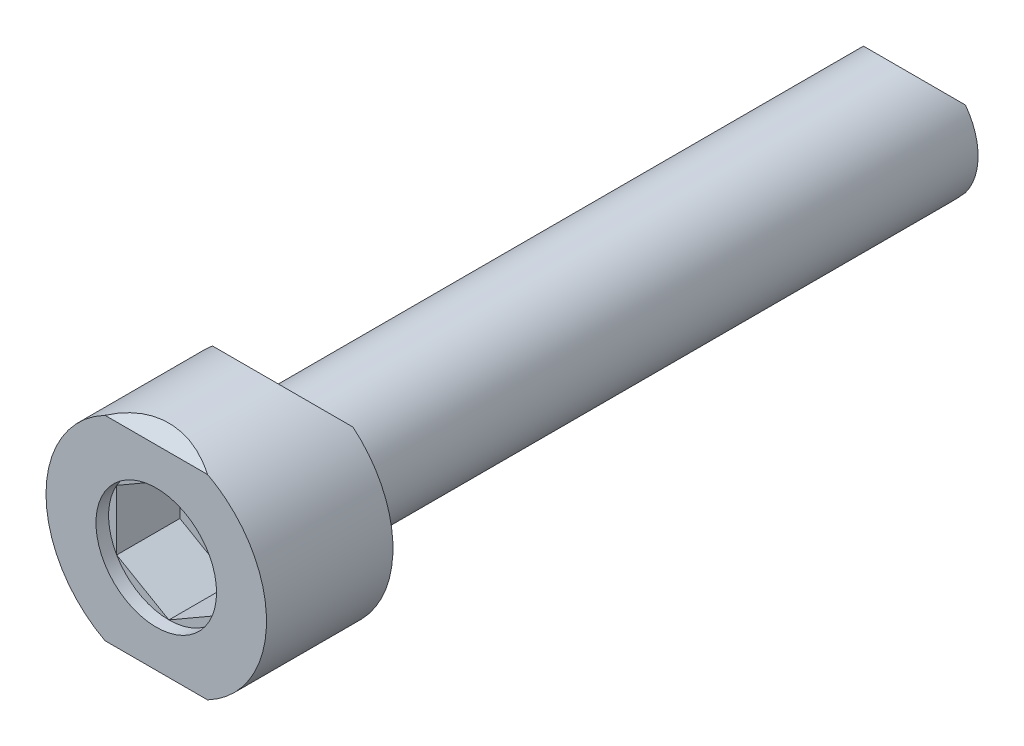
ISO-10303-21;
HEADER;
FILE_DESCRIPTION(('STEP AP214'),'2;1');
FILE_NAME('part.step','',(''),(''),'','','');
FILE_SCHEMA(('AUTOMOTIVE_DESIGN { 1 0 10303 214 1 1 1 1 }'));
ENDSEC;
DATA;
#1=APPLICATION_CONTEXT('core data for automotive mechanical design processes');
#2=APPLICATION_PROTOCOL_DEFINITION('international standard','automotive_design',2000,#1);
#3=PRODUCT_CONTEXT('',#1,'mechanical');
#4=PRODUCT('Part','Part','',(#3));
#5=PRODUCT_RELATED_PRODUCT_CATEGORY('part','',(#4));
#6=PRODUCT_DEFINITION_FORMATION('','',#4);
#7=PRODUCT_DEFINITION_CONTEXT('part definition',#1,'design');
#8=PRODUCT_DEFINITION('design','',#6,#7);
#9=PRODUCT_DEFINITION_SHAPE('','',#8);
#10=(LENGTH_UNIT() NAMED_UNIT(*) SI_UNIT(.MILLI.,.METRE.));
#11=(NAMED_UNIT(*) PLANE_ANGLE_UNIT() SI_UNIT($,.RADIAN.));
#12=(NAMED_UNIT(*) SI_UNIT($,.STERADIAN.) SOLID_ANGLE_UNIT());
#13=UNCERTAINTY_MEASURE_WITH_UNIT(LENGTH_MEASURE(1.E-05),#10,'distance_accuracy_value','');
#14=(GEOMETRIC_REPRESENTATION_CONTEXT(3) GLOBAL_UNCERTAINTY_ASSIGNED_CONTEXT((#13)) GLOBAL_UNIT_ASSIGNED_CONTEXT((#10,
#11,#12)) REPRESENTATION_CONTEXT('',''));
#15=CARTESIAN_POINT('',(0.,0.,0.));
#16=DIRECTION('',(0.,0.,1.));
#17=DIRECTION('',(1.,0.,0.));
#18=AXIS2_PLACEMENT_3D('',#15,#16,#17);
#19=CARTESIAN_POINT('',(4.36,0.,-12.5));
#20=DIRECTION('',(0.,0.,1.));
#21=DIRECTION('',(1.,0.,0.));
#22=AXIS2_PLACEMENT_3D('',#19,#20,#21);
#23=CYLINDRICAL_SURFACE('',#22,4.36);
#24=CARTESIAN_POINT('',(4.36,0.,21.36));
#25=DIRECTION('',(0.,-0.707106781186548,-0.707106781186547));
#26=DIRECTION('',(0.,-0.707106781186547,0.707106781186548));
#27=AXIS2_PLACEMENT_3D('',#24,#25,#26);
#28=ELLIPSE('',#27,6.1659711319467,4.36);
#29=CARTESIAN_POINT('',(2.33268650672866,3.86,17.5));
#30=VERTEX_POINT('',#29);
#31=CARTESIAN_POINT('',(6.38731349327134,3.86,17.5));
#32=VERTEX_POINT('',#31);
#33=EDGE_CURVE('E178',#30,#32,#28,.T.);
#34=ORIENTED_EDGE('',*,*,#33,.T.);
#35=CARTESIAN_POINT('',(4.36,0.,17.5));
#36=DIRECTION('',(0.,0.,1.));
#37=DIRECTION('',(1.,0.,0.));
#38=AXIS2_PLACEMENT_3D('',#35,#36,#37);
#39=CIRCLE('',#38,4.36);
#40=CARTESIAN_POINT('',(6.38731349327132,-3.86000000000001,17.5));
#41=VERTEX_POINT('',#40);
#42=EDGE_CURVE('E199',#41,#32,#39,.T.);
#43=ORIENTED_EDGE('',*,*,#42,.F.);
#44=CARTESIAN_POINT('',(4.36,0.,21.36));
#45=DIRECTION('',(0.,0.707106781186548,-0.707106781186547));
#46=DIRECTION('',(0.,0.707106781186547,0.707106781186548));
#47=AXIS2_PLACEMENT_3D('',#44,#45,#46);
#48=ELLIPSE('',#47,6.1659711319467,4.36);
#49=CARTESIAN_POINT('',(2.33268650672868,-3.86000000000001,17.5));
#50=VERTEX_POINT('',#49);
#51=EDGE_CURVE('E182',#41,#50,#48,.T.);
#52=ORIENTED_EDGE('',*,*,#51,.T.);
#53=EDGE_CURVE('E198',#30,#50,#39,.T.);
#54=ORIENTED_EDGE('',*,*,#53,.F.);
#55=EDGE_LOOP('',(#34,#43,#52,#54));
#56=FACE_BOUND('',#55,.T.);
#57=CARTESIAN_POINT('',(4.36,0.,12.5));
#58=DIRECTION('',(0.,0.,1.));
#59=DIRECTION('',(0.,-1.,0.));
#60=AXIS2_PLACEMENT_3D('',#57,#58,#59);
#61=CIRCLE('',#60,4.36);
#62=CARTESIAN_POINT('',(7.13848879788996,-3.36,12.5));
#63=VERTEX_POINT('',#62);
#64=CARTESIAN_POINT('',(7.13848879788997,3.36,12.5));
#65=VERTEX_POINT('',#64);
#66=EDGE_CURVE('E215',#63,#65,#61,.T.);
#67=ORIENTED_EDGE('',*,*,#66,.T.);
#68=CARTESIAN_POINT('',(4.36,0.,9.14000000000001));
#69=DIRECTION('',(0.,-0.707106781186548,0.707106781186547));
#70=DIRECTION('',(0.,0.707106781186547,0.707106781186548));
#71=AXIS2_PLACEMENT_3D('',#68,#69,#70);
#72=ELLIPSE('',#71,6.1659711319467,4.36);
#73=CARTESIAN_POINT('',(1.58151120211004,3.36,12.5));
#74=VERTEX_POINT('',#73);
#75=EDGE_CURVE('E205',#65,#74,#72,.T.);
#76=ORIENTED_EDGE('',*,*,#75,.T.);
#77=CARTESIAN_POINT('',(1.58151120211004,-3.36,12.5));
#78=VERTEX_POINT('',#77);
#79=EDGE_CURVE('E208',#74,#78,#61,.T.);
#80=ORIENTED_EDGE('',*,*,#79,.T.);
#81=CARTESIAN_POINT('',(4.36,0.,9.14));
#82=DIRECTION('',(0.,0.707106781186548,0.707106781186547));
#83=DIRECTION('',(0.,-0.707106781186547,0.707106781186548));
#84=AXIS2_PLACEMENT_3D('',#81,#82,#83);
#85=ELLIPSE('',#84,6.1659711319467,4.36);
#86=EDGE_CURVE('E91',#78,#63,#85,.T.);
#87=ORIENTED_EDGE('',*,*,#86,.T.);
#88=EDGE_LOOP('',(#67,#76,#80,#87));
#89=FACE_BOUND('',#88,.T.);
#90=ADVANCED_FACE('F68',(#56,#89),#23,.T.);
#91=CARTESIAN_POINT('',(4.36,0.,17.));
#92=DIRECTION('',(0.,0.,1.));
#93=DIRECTION('',(1.,0.,0.));
#94=AXIS2_PLACEMENT_3D('',#91,#92,#93);
#95=PLANE('',#94);
#96=DIRECTION('',(-0.866025403784441,0.499999999999995,0.));
#97=VECTOR('',#96,1.);
#98=CARTESIAN_POINT('',(6.42488048914068,1.19215930624981,17.));
#99=LINE('',#98,#97);
#100=CARTESIAN_POINT('',(6.42488048914068,1.19215930624981,17.));
#101=VERTEX_POINT('',#100);
#102=CARTESIAN_POINT('',(4.36,2.38431861249957,17.));
#103=VERTEX_POINT('',#102);
#104=EDGE_CURVE('E167',#101,#103,#99,.T.);
#105=ORIENTED_EDGE('',*,*,#104,.F.);
#106=CARTESIAN_POINT('',(4.36,0.,17.));
#107=DIRECTION('',(0.,0.,1.));
#108=DIRECTION('',(1.,0.,0.));
#109=AXIS2_PLACEMENT_3D('',#106,#107,#108);
#110=CIRCLE('',#109,2.38431861249957);
#111=EDGE_CURVE('E210',#101,#103,#110,.T.);
#112=ORIENTED_EDGE('',*,*,#111,.T.);
#113=EDGE_LOOP('',(#105,#112));
#114=FACE_BOUND('',#113,.T.);
#115=ADVANCED_FACE('F234',(#114),#95,.T.);
#116=DIRECTION('',(-0.866025403784438,-0.500000000000001,0.));
#117=VECTOR('',#116,1.);
#118=CARTESIAN_POINT('',(4.36,2.38431861249957,17.));
#119=LINE('',#118,#117);
#120=CARTESIAN_POINT('',(2.2951195108593,1.19215930624978,17.));
#121=VERTEX_POINT('',#120);
#122=EDGE_CURVE('E285',#103,#121,#119,.T.);
#123=ORIENTED_EDGE('',*,*,#122,.F.);
#124=EDGE_CURVE('E308',#103,#121,#110,.T.);
#125=ORIENTED_EDGE('',*,*,#124,.T.);
#126=EDGE_LOOP('',(#123,#125));
#127=FACE_BOUND('',#126,.T.);
#128=ADVANCED_FACE('F239',(#127),#95,.T.);
#129=DIRECTION('',(0.,-1.,0.));
#130=VECTOR('',#129,1.);
#131=CARTESIAN_POINT('',(2.2951195108593,1.19215930624978,17.));
#132=LINE('',#131,#130);
#133=CARTESIAN_POINT('',(2.29511951085931,-1.1921593062498,17.));
#134=VERTEX_POINT('',#133);
#135=EDGE_CURVE('E288',#121,#134,#132,.T.);
#136=ORIENTED_EDGE('',*,*,#135,.F.);
#137=EDGE_CURVE('E313',#121,#134,#110,.T.);
#138=ORIENTED_EDGE('',*,*,#137,.T.);
#139=EDGE_LOOP('',(#136,#138));
#140=FACE_BOUND('',#139,.T.);
#141=ADVANCED_FACE('F354',(#140),#95,.T.);
#142=DIRECTION('',(0.866025403784442,-0.499999999999995,0.));
#143=VECTOR('',#142,1.);
#144=CARTESIAN_POINT('',(2.29511951085931,-1.1921593062498,17.));
#145=LINE('',#144,#143);
#146=CARTESIAN_POINT('',(4.36000000000002,-2.38431861249957,17.));
#147=VERTEX_POINT('',#146);
#148=EDGE_CURVE('E291',#134,#147,#145,.T.);
#149=ORIENTED_EDGE('',*,*,#148,.F.);
#150=EDGE_CURVE('E320',#134,#147,#110,.T.);
#151=ORIENTED_EDGE('',*,*,#150,.T.);
#152=EDGE_LOOP('',(#149,#151));
#153=FACE_BOUND('',#152,.T.);
#154=ADVANCED_FACE('F361',(#153),#95,.T.);
#155=DIRECTION('',(0.866025403784435,0.500000000000007,0.));
#156=VECTOR('',#155,1.);
#157=CARTESIAN_POINT('',(4.36000000000002,-2.38431861249957,17.));
#158=LINE('',#157,#156);
#159=CARTESIAN_POINT('',(6.4248804891407,-1.19215930624977,17.));
#160=VERTEX_POINT('',#159);
#161=EDGE_CURVE('E83',#147,#160,#158,.T.);
#162=ORIENTED_EDGE('',*,*,#161,.F.);
#163=EDGE_CURVE('E315',#147,#160,#110,.T.);
#164=ORIENTED_EDGE('',*,*,#163,.T.);
#165=EDGE_LOOP('',(#162,#164));
#166=FACE_BOUND('',#165,.T.);
#167=ADVANCED_FACE('F340',(#166),#95,.T.);
#168=CARTESIAN_POINT('',(10.,3.36,12.5));
#169=DIRECTION('',(0.,-0.707106781186548,0.707106781186547));
#170=DIRECTION('',(0.,-0.707106781186547,-0.707106781186548));
#171=AXIS2_PLACEMENT_3D('',#168,#169,#170);
#172=PLANE('',#171);
#173=DIRECTION('',(-1.,0.,0.));
#174=VECTOR('',#173,1.);
#175=CARTESIAN_POINT('',(10.,3.36,12.5));
#176=LINE('',#175,#174);
#177=EDGE_CURVE('E13',#65,#74,#176,.T.);
#178=ORIENTED_EDGE('',*,*,#177,.T.);
#179=ORIENTED_EDGE('',*,*,#75,.F.);
#180=EDGE_LOOP('',(#178,#179));
#181=FACE_BOUND('',#180,.T.);
#182=ADVANCED_FACE('F70',(#181),#172,.F.);
#183=CARTESIAN_POINT('',(10.,-3.36,12.5));
#184=DIRECTION('',(0.,0.,1.));
#185=DIRECTION('',(0.,-1.,0.));
#186=AXIS2_PLACEMENT_3D('',#183,#184,#185);
#187=PLANE('',#186);
#188=CARTESIAN_POINT('',(4.36,0.,12.5));
#189=DIRECTION('',(0.,0.,-1.));
#190=DIRECTION('',(-1.,0.,0.));
#191=AXIS2_PLACEMENT_3D('',#188,#189,#190);
#192=CIRCLE('',#191,2.5);
#193=CARTESIAN_POINT('',(1.86,0.,12.5));
#194=VERTEX_POINT('',#193);
#195=EDGE_CURVE('E258',#194,#194,#192,.T.);
#196=ORIENTED_EDGE('',*,*,#195,.F.);
#197=EDGE_LOOP('',(#196));
#198=FACE_BOUND('',#197,.T.);
#199=ORIENTED_EDGE('',*,*,#66,.F.);
#200=DIRECTION('',(-1.,0.,0.));
#201=VECTOR('',#200,1.);
#202=CARTESIAN_POINT('',(10.,-3.36,12.5));
#203=LINE('',#202,#201);
#204=EDGE_CURVE('E180',#63,#78,#203,.T.);
#205=ORIENTED_EDGE('',*,*,#204,.T.);
#206=ORIENTED_EDGE('',*,*,#79,.F.);
#207=ORIENTED_EDGE('',*,*,#177,.F.);
#208=EDGE_LOOP('',(#199,#205,#206,#207));
#209=FACE_BOUND('',#208,.T.);
#210=ADVANCED_FACE('F221',(#198,#209),#187,.F.);
#211=CARTESIAN_POINT('',(10.,-3.36,12.5));
#212=DIRECTION('',(0.,0.707106781186548,0.707106781186547));
#213=DIRECTION('',(0.,-0.707106781186547,0.707106781186548));
#214=AXIS2_PLACEMENT_3D('',#211,#212,#213);
#215=PLANE('',#214);
#216=ORIENTED_EDGE('',*,*,#204,.F.);
#217=ORIENTED_EDGE('',*,*,#86,.F.);
#218=EDGE_LOOP('',(#216,#217));
#219=FACE_BOUND('',#218,.T.);
#220=ADVANCED_FACE('F223',(#219),#215,.F.);
#221=CARTESIAN_POINT('',(10.,4.36,17.));
#222=DIRECTION('',(0.,-0.707106781186548,-0.707106781186547));
#223=DIRECTION('',(0.,0.707106781186547,-0.707106781186548));
#224=AXIS2_PLACEMENT_3D('',#221,#222,#223);
#225=PLANE('',#224);
#226=ORIENTED_EDGE('',*,*,#33,.F.);
#227=DIRECTION('',(-1.,0.,0.));
#228=VECTOR('',#227,1.);
#229=CARTESIAN_POINT('',(10.,3.86,17.5));
#230=LINE('',#229,#228);
#231=EDGE_CURVE('E76',#32,#30,#230,.T.);
#232=ORIENTED_EDGE('',*,*,#231,.F.);
#233=EDGE_LOOP('',(#226,#232));
#234=FACE_BOUND('',#233,.T.);
#235=ADVANCED_FACE('F202',(#234),#225,.F.);
#236=CARTESIAN_POINT('',(10.,-3.86,17.5));
#237=DIRECTION('',(0.,0.,-1.));
#238=DIRECTION('',(-1.,0.,0.));
#239=AXIS2_PLACEMENT_3D('',#236,#237,#238);
#240=PLANE('',#239);
#241=CARTESIAN_POINT('',(4.36,0.,17.5));
#242=DIRECTION('',(0.,0.,1.));
#243=DIRECTION('',(1.,0.,0.));
#244=AXIS2_PLACEMENT_3D('',#241,#242,#243);
#245=CIRCLE('',#244,2.38431861249957);
#246=CARTESIAN_POINT('',(6.74431861249957,0.,17.5));
#247=VERTEX_POINT('',#246);
#248=EDGE_CURVE('E212',#247,#247,#245,.T.);
#249=ORIENTED_EDGE('',*,*,#248,.F.);
#250=EDGE_LOOP('',(#249));
#251=FACE_BOUND('',#250,.T.);
#252=ORIENTED_EDGE('',*,*,#42,.T.);
#253=ORIENTED_EDGE('',*,*,#231,.T.);
#254=ORIENTED_EDGE('',*,*,#53,.T.);
#255=DIRECTION('',(-1.,0.,0.));
#256=VECTOR('',#255,1.);
#257=CARTESIAN_POINT('',(10.,-3.86,17.5));
#258=LINE('',#257,#256);
#259=EDGE_CURVE('E189',#41,#50,#258,.T.);
#260=ORIENTED_EDGE('',*,*,#259,.F.);
#261=EDGE_LOOP('',(#252,#253,#254,#260));
#262=FACE_BOUND('',#261,.T.);
#263=ADVANCED_FACE('F196',(#251,#262),#240,.F.);
#264=CARTESIAN_POINT('',(10.,-4.36,17.));
#265=DIRECTION('',(0.,0.707106781186548,-0.707106781186547));
#266=DIRECTION('',(0.,0.707106781186547,0.707106781186548));
#267=AXIS2_PLACEMENT_3D('',#264,#265,#266);
#268=PLANE('',#267);
#269=ORIENTED_EDGE('',*,*,#51,.F.);
#270=ORIENTED_EDGE('',*,*,#259,.T.);
#271=EDGE_LOOP('',(#269,#270));
#272=FACE_BOUND('',#271,.T.);
#273=ADVANCED_FACE('F326',(#272),#268,.F.);
#274=CARTESIAN_POINT('',(4.36,0.,17.));
#275=DIRECTION('',(0.,0.,1.));
#276=DIRECTION('',(1.,0.,0.));
#277=AXIS2_PLACEMENT_3D('',#274,#275,#276);
#278=CYLINDRICAL_SURFACE('',#277,2.38431861249957);
#279=ORIENTED_EDGE('',*,*,#111,.F.);
#280=EDGE_CURVE('E309',#160,#101,#110,.T.);
#281=ORIENTED_EDGE('',*,*,#280,.F.);
#282=ORIENTED_EDGE('',*,*,#163,.F.);
#283=ORIENTED_EDGE('',*,*,#150,.F.);
#284=ORIENTED_EDGE('',*,*,#137,.F.);
#285=ORIENTED_EDGE('',*,*,#124,.F.);
#286=EDGE_LOOP('',(#279,#281,#282,#283,#284,#285));
#287=FACE_BOUND('',#286,.T.);
#288=ORIENTED_EDGE('',*,*,#248,.T.);
#289=EDGE_LOOP('',(#288));
#290=FACE_BOUND('',#289,.T.);
#291=ADVANCED_FACE('F245',(#287,#290),#278,.F.);
#292=DIRECTION('',(0.,1.,0.));
#293=VECTOR('',#292,1.);
#294=CARTESIAN_POINT('',(6.4248804891407,-1.19215930624977,17.));
#295=LINE('',#294,#293);
#296=EDGE_CURVE('E267',#160,#101,#295,.T.);
#297=ORIENTED_EDGE('',*,*,#296,.F.);
#298=ORIENTED_EDGE('',*,*,#280,.T.);
#299=EDGE_LOOP('',(#297,#298));
#300=FACE_BOUND('',#299,.T.);
#301=ADVANCED_FACE('F242',(#300),#95,.T.);
#302=CARTESIAN_POINT('',(6.42488048914068,1.19215930624981,14.5));
#303=DIRECTION('',(0.499999999999995,0.866025403784442,0.));
#304=DIRECTION('',(-0.866025403784442,0.499999999999995,0.));
#305=AXIS2_PLACEMENT_3D('',#302,#303,#304);
#306=PLANE('',#305);
#307=ORIENTED_EDGE('',*,*,#104,.T.);
#308=DIRECTION('',(0.,0.,1.));
#309=VECTOR('',#308,1.);
#310=CARTESIAN_POINT('',(4.36,2.38431861249957,14.5));
#311=LINE('',#310,#309);
#312=CARTESIAN_POINT('',(4.36,2.38431861249957,14.5));
#313=VERTEX_POINT('',#312);
#314=EDGE_CURVE('E282',#313,#103,#311,.T.);
#315=ORIENTED_EDGE('',*,*,#314,.F.);
#316=DIRECTION('',(-0.866025403784441,0.499999999999995,0.));
#317=VECTOR('',#316,1.);
#318=CARTESIAN_POINT('',(6.42488048914068,1.19215930624981,14.5));
#319=LINE('',#318,#317);
#320=CARTESIAN_POINT('',(6.42488048914068,1.19215930624981,14.5));
#321=VERTEX_POINT('',#320);
#322=EDGE_CURVE('E263',#321,#313,#319,.T.);
#323=ORIENTED_EDGE('',*,*,#322,.F.);
#324=DIRECTION('',(0.,0.,1.));
#325=VECTOR('',#324,1.);
#326=CARTESIAN_POINT('',(6.42488048914068,1.19215930624981,14.5));
#327=LINE('',#326,#325);
#328=EDGE_CURVE('E297',#321,#101,#327,.T.);
#329=ORIENTED_EDGE('',*,*,#328,.T.);
#330=EDGE_LOOP('',(#307,#315,#323,#329));
#331=FACE_BOUND('',#330,.T.);
#332=ADVANCED_FACE('F339',(#331),#306,.F.);
#333=CARTESIAN_POINT('',(6.4248804891407,-1.19215930624977,14.5));
#334=DIRECTION('',(1.,0.,0.));
#335=DIRECTION('',(0.,1.,0.));
#336=AXIS2_PLACEMENT_3D('',#333,#334,#335);
#337=PLANE('',#336);
#338=ORIENTED_EDGE('',*,*,#296,.T.);
#339=ORIENTED_EDGE('',*,*,#328,.F.);
#340=DIRECTION('',(0.,1.,0.));
#341=VECTOR('',#340,1.);
#342=CARTESIAN_POINT('',(6.4248804891407,-1.19215930624977,14.5));
#343=LINE('',#342,#341);
#344=CARTESIAN_POINT('',(6.4248804891407,-1.19215930624977,14.5));
#345=VERTEX_POINT('',#344);
#346=EDGE_CURVE('E279',#345,#321,#343,.T.);
#347=ORIENTED_EDGE('',*,*,#346,.F.);
#348=DIRECTION('',(0.,0.,1.));
#349=VECTOR('',#348,1.);
#350=CARTESIAN_POINT('',(6.4248804891407,-1.19215930624977,14.5));
#351=LINE('',#350,#349);
#352=EDGE_CURVE('E299',#345,#160,#351,.T.);
#353=ORIENTED_EDGE('',*,*,#352,.T.);
#354=EDGE_LOOP('',(#338,#339,#347,#353));
#355=FACE_BOUND('',#354,.T.);
#356=ADVANCED_FACE('F372',(#355),#337,.F.);
#357=CARTESIAN_POINT('',(4.36000000000002,-2.38431861249957,14.5));
#358=DIRECTION('',(0.500000000000007,-0.866025403784435,0.));
#359=DIRECTION('',(0.866025403784435,0.500000000000007,0.));
#360=AXIS2_PLACEMENT_3D('',#357,#358,#359);
#361=PLANE('',#360);
#362=ORIENTED_EDGE('',*,*,#161,.T.);
#363=ORIENTED_EDGE('',*,*,#352,.F.);
#364=DIRECTION('',(0.866025403784435,0.500000000000007,0.));
#365=VECTOR('',#364,1.);
#366=CARTESIAN_POINT('',(4.36000000000002,-2.38431861249957,14.5));
#367=LINE('',#366,#365);
#368=CARTESIAN_POINT('',(4.36000000000002,-2.38431861249957,14.5));
#369=VERTEX_POINT('',#368);
#370=EDGE_CURVE('E276',#369,#345,#367,.T.);
#371=ORIENTED_EDGE('',*,*,#370,.F.);
#372=DIRECTION('',(0.,0.,1.));
#373=VECTOR('',#372,1.);
#374=CARTESIAN_POINT('',(4.36000000000002,-2.38431861249957,14.5));
#375=LINE('',#374,#373);
#376=EDGE_CURVE('E301',#369,#147,#375,.T.);
#377=ORIENTED_EDGE('',*,*,#376,.T.);
#378=EDGE_LOOP('',(#362,#363,#371,#377));
#379=FACE_BOUND('',#378,.T.);
#380=ADVANCED_FACE('F381',(#379),#361,.F.);
#381=CARTESIAN_POINT('',(2.29511951085931,-1.1921593062498,14.5));
#382=DIRECTION('',(-0.499999999999995,-0.866025403784442,0.));
#383=DIRECTION('',(0.866025403784442,-0.499999999999995,0.));
#384=AXIS2_PLACEMENT_3D('',#381,#382,#383);
#385=PLANE('',#384);
#386=ORIENTED_EDGE('',*,*,#148,.T.);
#387=ORIENTED_EDGE('',*,*,#376,.F.);
#388=DIRECTION('',(0.866025403784442,-0.499999999999995,0.));
#389=VECTOR('',#388,1.);
#390=CARTESIAN_POINT('',(2.29511951085931,-1.1921593062498,14.5));
#391=LINE('',#390,#389);
#392=CARTESIAN_POINT('',(2.29511951085931,-1.1921593062498,14.5));
#393=VERTEX_POINT('',#392);
#394=EDGE_CURVE('E273',#393,#369,#391,.T.);
#395=ORIENTED_EDGE('',*,*,#394,.F.);
#396=DIRECTION('',(0.,0.,1.));
#397=VECTOR('',#396,1.);
#398=CARTESIAN_POINT('',(2.29511951085931,-1.1921593062498,14.5));
#399=LINE('',#398,#397);
#400=EDGE_CURVE('E303',#393,#134,#399,.T.);
#401=ORIENTED_EDGE('',*,*,#400,.T.);
#402=EDGE_LOOP('',(#386,#387,#395,#401));
#403=FACE_BOUND('',#402,.T.);
#404=ADVANCED_FACE('F378',(#403),#385,.F.);
#405=CARTESIAN_POINT('',(2.2951195108593,1.19215930624978,14.5));
#406=DIRECTION('',(-1.,0.,0.));
#407=DIRECTION('',(0.,-1.,0.));
#408=AXIS2_PLACEMENT_3D('',#405,#406,#407);
#409=PLANE('',#408);
#410=ORIENTED_EDGE('',*,*,#135,.T.);
#411=ORIENTED_EDGE('',*,*,#400,.F.);
#412=DIRECTION('',(0.,-1.,0.));
#413=VECTOR('',#412,1.);
#414=CARTESIAN_POINT('',(2.2951195108593,1.19215930624978,14.5));
#415=LINE('',#414,#413);
#416=CARTESIAN_POINT('',(2.2951195108593,1.19215930624978,14.5));
#417=VERTEX_POINT('',#416);
#418=EDGE_CURVE('E270',#417,#393,#415,.T.);
#419=ORIENTED_EDGE('',*,*,#418,.F.);
#420=DIRECTION('',(0.,0.,1.));
#421=VECTOR('',#420,1.);
#422=CARTESIAN_POINT('',(2.2951195108593,1.19215930624978,14.5));
#423=LINE('',#422,#421);
#424=EDGE_CURVE('E305',#417,#121,#423,.T.);
#425=ORIENTED_EDGE('',*,*,#424,.T.);
#426=EDGE_LOOP('',(#410,#411,#419,#425));
#427=FACE_BOUND('',#426,.T.);
#428=ADVANCED_FACE('F357',(#427),#409,.F.);
#429=CARTESIAN_POINT('',(4.36,2.38431861249957,14.5));
#430=DIRECTION('',(-0.500000000000001,0.866025403784438,0.));
#431=DIRECTION('',(-0.866025403784438,-0.500000000000001,0.));
#432=AXIS2_PLACEMENT_3D('',#429,#430,#431);
#433=PLANE('',#432);
#434=ORIENTED_EDGE('',*,*,#122,.T.);
#435=ORIENTED_EDGE('',*,*,#424,.F.);
#436=DIRECTION('',(-0.866025403784438,-0.500000000000001,0.));
#437=VECTOR('',#436,1.);
#438=CARTESIAN_POINT('',(4.36,2.38431861249957,14.5));
#439=LINE('',#438,#437);
#440=EDGE_CURVE('E266',#313,#417,#439,.T.);
#441=ORIENTED_EDGE('',*,*,#440,.F.);
#442=ORIENTED_EDGE('',*,*,#314,.T.);
#443=EDGE_LOOP('',(#434,#435,#441,#442));
#444=FACE_BOUND('',#443,.T.);
#445=ADVANCED_FACE('F350',(#444),#433,.F.);
#446=CARTESIAN_POINT('',(0.,0.,14.5));
#447=DIRECTION('',(0.,0.,1.));
#448=DIRECTION('',(1.,0.,0.));
#449=AXIS2_PLACEMENT_3D('',#446,#447,#448);
#450=PLANE('',#449);
#451=ORIENTED_EDGE('',*,*,#322,.T.);
#452=ORIENTED_EDGE('',*,*,#440,.T.);
#453=ORIENTED_EDGE('',*,*,#418,.T.);
#454=ORIENTED_EDGE('',*,*,#394,.T.);
#455=ORIENTED_EDGE('',*,*,#370,.T.);
#456=ORIENTED_EDGE('',*,*,#346,.T.);
#457=EDGE_LOOP('',(#451,#452,#453,#454,#455,#456));
#458=FACE_BOUND('',#457,.T.);
#459=ADVANCED_FACE('F256',(#458),#450,.T.);
#460=CARTESIAN_POINT('',(4.36,0.,12.5));
#461=DIRECTION('',(0.,0.,-1.));
#462=DIRECTION('',(-1.,0.,0.));
#463=AXIS2_PLACEMENT_3D('',#460,#461,#462);
#464=CYLINDRICAL_SURFACE('',#463,2.5);
#465=CARTESIAN_POINT('',(4.36,0.,-14.));
#466=DIRECTION('',(0.,-0.707106781186548,0.707106781186547));
#467=DIRECTION('',(0.,-0.707106781186547,-0.707106781186548));
#468=AXIS2_PLACEMENT_3D('',#465,#466,#467);
#469=ELLIPSE('',#468,3.53553390593274,2.5);
#470=CARTESIAN_POINT('',(6.36,1.5,-12.5));
#471=VERTEX_POINT('',#470);
#472=CARTESIAN_POINT('',(2.36,1.5,-12.5));
#473=VERTEX_POINT('',#472);
#474=EDGE_CURVE('E156',#471,#473,#469,.T.);
#475=ORIENTED_EDGE('',*,*,#474,.T.);
#476=CARTESIAN_POINT('',(4.36,0.,-12.5));
#477=DIRECTION('',(0.,0.,-1.));
#478=DIRECTION('',(-1.,0.,0.));
#479=AXIS2_PLACEMENT_3D('',#476,#477,#478);
#480=CIRCLE('',#479,2.5);
#481=CARTESIAN_POINT('',(2.36,-1.5,-12.5));
#482=VERTEX_POINT('',#481);
#483=EDGE_CURVE('E160',#482,#473,#480,.T.);
#484=ORIENTED_EDGE('',*,*,#483,.F.);
#485=CARTESIAN_POINT('',(4.36,0.,-14.));
#486=DIRECTION('',(0.,0.707106781186548,0.707106781186547));
#487=DIRECTION('',(0.,0.707106781186547,-0.707106781186548));
#488=AXIS2_PLACEMENT_3D('',#485,#486,#487);
#489=ELLIPSE('',#488,3.53553390593274,2.5);
#490=CARTESIAN_POINT('',(6.36,-1.5,-12.5));
#491=VERTEX_POINT('',#490);
#492=EDGE_CURVE('E168',#482,#491,#489,.T.);
#493=ORIENTED_EDGE('',*,*,#492,.T.);
#494=EDGE_CURVE('E163',#471,#491,#480,.T.);
#495=ORIENTED_EDGE('',*,*,#494,.F.);
#496=EDGE_LOOP('',(#475,#484,#493,#495));
#497=FACE_BOUND('',#496,.T.);
#498=ORIENTED_EDGE('',*,*,#195,.T.);
#499=EDGE_LOOP('',(#498));
#500=FACE_BOUND('',#499,.T.);
#501=ADVANCED_FACE('F158',(#497,#500),#464,.T.);
#502=CARTESIAN_POINT('',(10.,-1.5,-12.5));
#503=DIRECTION('',(0.,0.707106781186548,0.707106781186547));
#504=DIRECTION('',(0.,-0.707106781186547,0.707106781186548));
#505=AXIS2_PLACEMENT_3D('',#502,#503,#504);
#506=PLANE('',#505);
#507=ORIENTED_EDGE('',*,*,#492,.F.);
#508=DIRECTION('',(-1.,0.,0.));
#509=VECTOR('',#508,1.);
#510=CARTESIAN_POINT('',(10.,-1.5,-12.5));
#511=LINE('',#510,#509);
#512=EDGE_CURVE('E175',#491,#482,#511,.T.);
#513=ORIENTED_EDGE('',*,*,#512,.F.);
#514=EDGE_LOOP('',(#507,#513));
#515=FACE_BOUND('',#514,.T.);
#516=ADVANCED_FACE('F250',(#515),#506,.F.);
#517=CARTESIAN_POINT('',(10.,-1.5,-12.5));
#518=DIRECTION('',(0.,0.,1.));
#519=DIRECTION('',(1.,0.,0.));
#520=AXIS2_PLACEMENT_3D('',#517,#518,#519);
#521=PLANE('',#520);
#522=ORIENTED_EDGE('',*,*,#483,.T.);
#523=DIRECTION('',(-1.,0.,0.));
#524=VECTOR('',#523,1.);
#525=CARTESIAN_POINT('',(10.,1.5,-12.5));
#526=LINE('',#525,#524);
#527=EDGE_CURVE('E173',#471,#473,#526,.T.);
#528=ORIENTED_EDGE('',*,*,#527,.F.);
#529=ORIENTED_EDGE('',*,*,#494,.T.);
#530=ORIENTED_EDGE('',*,*,#512,.T.);
#531=EDGE_LOOP('',(#522,#528,#529,#530));
#532=FACE_BOUND('',#531,.T.);
#533=ADVANCED_FACE('F172',(#532),#521,.F.);
#534=CARTESIAN_POINT('',(10.,1.5,-12.5));
#535=DIRECTION('',(0.,-0.707106781186548,0.707106781186547));
#536=DIRECTION('',(0.,-0.707106781186547,-0.707106781186548));
#537=AXIS2_PLACEMENT_3D('',#534,#535,#536);
#538=PLANE('',#537);
#539=ORIENTED_EDGE('',*,*,#474,.F.);
#540=ORIENTED_EDGE('',*,*,#527,.T.);
#541=EDGE_LOOP('',(#539,#540));
#542=FACE_BOUND('',#541,.T.);
#543=ADVANCED_FACE('F177',(#542),#538,.F.);
#544=CLOSED_SHELL('',(#90,#115,#128,#141,#154,#167,#182,#210,#220,#235,#263,#273,#291,#301,#332,
#356,#380,#404,#428,#445,#459,#501,#516,#533,#543));
#545=MANIFOLD_SOLID_BREP('B2',#544);
#546=ADVANCED_BREP_SHAPE_REPRESENTATION('',(#18,#545),#14);
#547=SHAPE_DEFINITION_REPRESENTATION(#9,#546);
ENDSEC;
END-ISO-10303-21;
